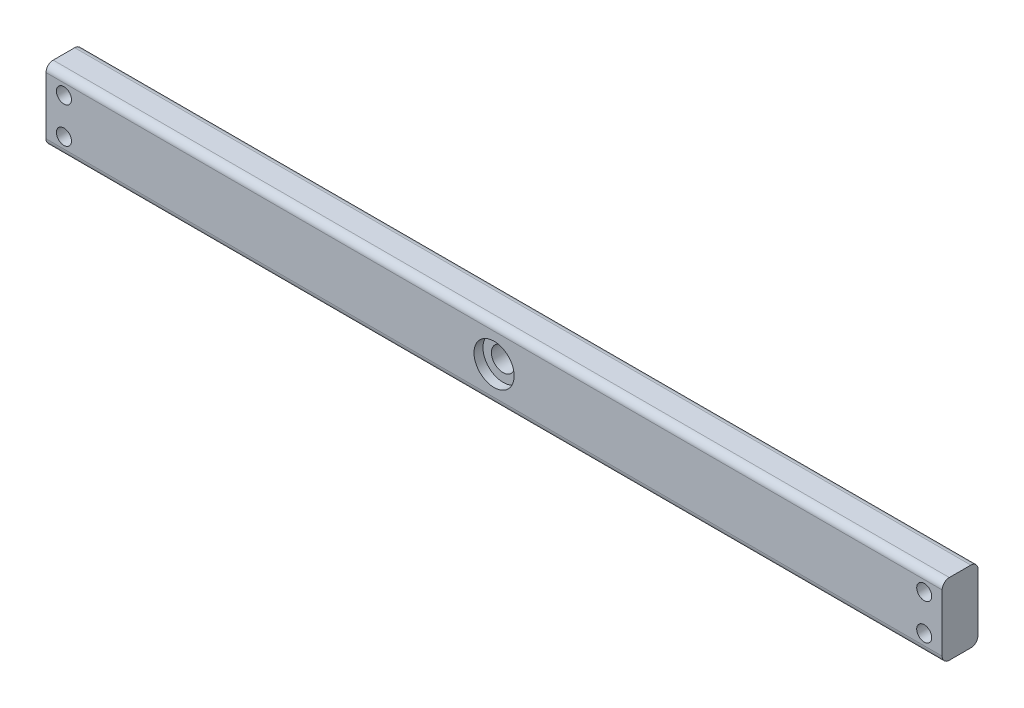
ISO-10303-21;
HEADER;
FILE_DESCRIPTION(('STEP AP214'),'2;1');
FILE_NAME('part.step','',(''),(''),'','','');
FILE_SCHEMA(('AUTOMOTIVE_DESIGN { 1 0 10303 214 1 1 1 1 }'));
ENDSEC;
DATA;
#1=APPLICATION_CONTEXT('core data for automotive mechanical design processes');
#2=APPLICATION_PROTOCOL_DEFINITION('international standard','automotive_design',2000,#1);
#3=PRODUCT_CONTEXT('',#1,'mechanical');
#4=PRODUCT('Part','Part','',(#3));
#5=PRODUCT_RELATED_PRODUCT_CATEGORY('part','',(#4));
#6=PRODUCT_DEFINITION_FORMATION('','',#4);
#7=PRODUCT_DEFINITION_CONTEXT('part definition',#1,'design');
#8=PRODUCT_DEFINITION('design','',#6,#7);
#9=PRODUCT_DEFINITION_SHAPE('','',#8);
#10=(LENGTH_UNIT() NAMED_UNIT(*) SI_UNIT(.MILLI.,.METRE.));
#11=(NAMED_UNIT(*) PLANE_ANGLE_UNIT() SI_UNIT($,.RADIAN.));
#12=(NAMED_UNIT(*) SI_UNIT($,.STERADIAN.) SOLID_ANGLE_UNIT());
#13=UNCERTAINTY_MEASURE_WITH_UNIT(LENGTH_MEASURE(1.E-05),#10,'distance_accuracy_value','');
#14=(GEOMETRIC_REPRESENTATION_CONTEXT(3) GLOBAL_UNCERTAINTY_ASSIGNED_CONTEXT((#13)) GLOBAL_UNIT_ASSIGNED_CONTEXT((#10,
#11,#12)) REPRESENTATION_CONTEXT('',''));
#15=CARTESIAN_POINT('',(0.,0.,0.));
#16=DIRECTION('',(0.,0.,1.));
#17=DIRECTION('',(1.,0.,0.));
#18=AXIS2_PLACEMENT_3D('',#15,#16,#17);
#19=CARTESIAN_POINT('',(0.,0.,5.));
#20=DIRECTION('',(0.,0.,-1.));
#21=DIRECTION('',(-1.,0.,0.));
#22=AXIS2_PLACEMENT_3D('',#19,#20,#21);
#23=CYLINDRICAL_SURFACE('',#22,3.25);
#24=CARTESIAN_POINT('',(0.,0.,-2.5));
#25=DIRECTION('',(0.,0.,-1.));
#26=DIRECTION('',(-1.,0.,0.));
#27=AXIS2_PLACEMENT_3D('',#24,#25,#26);
#28=CIRCLE('',#27,3.25);
#29=CARTESIAN_POINT('',(-3.25,0.,-2.5));
#30=VERTEX_POINT('',#29);
#31=EDGE_CURVE('E185',#30,#30,#28,.T.);
#32=ORIENTED_EDGE('',*,*,#31,.T.);
#33=EDGE_LOOP('',(#32));
#34=FACE_BOUND('',#33,.T.);
#35=CARTESIAN_POINT('',(0.,0.,2.5));
#36=DIRECTION('',(0.,0.,1.));
#37=DIRECTION('',(1.,0.,0.));
#38=AXIS2_PLACEMENT_3D('',#35,#36,#37);
#39=CIRCLE('',#38,3.25);
#40=CARTESIAN_POINT('',(3.25,0.,2.5));
#41=VERTEX_POINT('',#40);
#42=EDGE_CURVE('E142',#41,#41,#39,.T.);
#43=ORIENTED_EDGE('',*,*,#42,.T.);
#44=EDGE_LOOP('',(#43));
#45=FACE_BOUND('',#44,.T.);
#46=ADVANCED_FACE('F41',(#34,#45),#23,.F.);
#47=CARTESIAN_POINT('',(0.,0.,5.));
#48=DIRECTION('',(0.,0.,1.));
#49=DIRECTION('',(1.,0.,0.));
#50=AXIS2_PLACEMENT_3D('',#47,#48,#49);
#51=PLANE('',#50);
#52=CARTESIAN_POINT('',(120.,5.,5.));
#53=DIRECTION('',(0.,0.,1.));
#54=DIRECTION('',(-1.,0.,0.));
#55=AXIS2_PLACEMENT_3D('',#52,#53,#54);
#56=CIRCLE('',#55,2.1);
#57=CARTESIAN_POINT('',(117.9,5.,5.));
#58=VERTEX_POINT('',#57);
#59=EDGE_CURVE('E215',#58,#58,#56,.T.);
#60=ORIENTED_EDGE('',*,*,#59,.F.);
#61=EDGE_LOOP('',(#60));
#62=FACE_BOUND('',#61,.T.);
#63=CARTESIAN_POINT('',(120.,-5.,5.));
#64=DIRECTION('',(0.,0.,1.));
#65=DIRECTION('',(-1.,0.,0.));
#66=AXIS2_PLACEMENT_3D('',#63,#64,#65);
#67=CIRCLE('',#66,2.1);
#68=CARTESIAN_POINT('',(117.9,-5.,5.));
#69=VERTEX_POINT('',#68);
#70=EDGE_CURVE('E217',#69,#69,#67,.T.);
#71=ORIENTED_EDGE('',*,*,#70,.F.);
#72=EDGE_LOOP('',(#71));
#73=FACE_BOUND('',#72,.T.);
#74=CARTESIAN_POINT('',(-120.,-5.,5.));
#75=DIRECTION('',(0.,0.,1.));
#76=DIRECTION('',(1.,0.,0.));
#77=AXIS2_PLACEMENT_3D('',#74,#75,#76);
#78=CIRCLE('',#77,2.1);
#79=CARTESIAN_POINT('',(-117.9,-5.,5.));
#80=VERTEX_POINT('',#79);
#81=EDGE_CURVE('E206',#80,#80,#78,.T.);
#82=ORIENTED_EDGE('',*,*,#81,.F.);
#83=EDGE_LOOP('',(#82));
#84=FACE_BOUND('',#83,.T.);
#85=CARTESIAN_POINT('',(-120.,5.,5.));
#86=DIRECTION('',(0.,0.,1.));
#87=DIRECTION('',(1.,0.,0.));
#88=AXIS2_PLACEMENT_3D('',#85,#86,#87);
#89=CIRCLE('',#88,2.1);
#90=CARTESIAN_POINT('',(-117.9,5.,5.));
#91=VERTEX_POINT('',#90);
#92=EDGE_CURVE('E201',#91,#91,#89,.T.);
#93=ORIENTED_EDGE('',*,*,#92,.F.);
#94=EDGE_LOOP('',(#93));
#95=FACE_BOUND('',#94,.T.);
#96=CARTESIAN_POINT('',(0.,0.,5.));
#97=DIRECTION('',(0.,0.,1.));
#98=DIRECTION('',(1.,0.,0.));
#99=AXIS2_PLACEMENT_3D('',#96,#97,#98);
#100=CIRCLE('',#99,5.6);
#101=CARTESIAN_POINT('',(5.6,0.,5.));
#102=VERTEX_POINT('',#101);
#103=EDGE_CURVE('E198',#102,#102,#100,.T.);
#104=ORIENTED_EDGE('',*,*,#103,.F.);
#105=EDGE_LOOP('',(#104));
#106=FACE_BOUND('',#105,.T.);
#107=DIRECTION('',(0.,-1.,0.));
#108=VECTOR('',#107,1.);
#109=CARTESIAN_POINT('',(-125.,10.,5.));
#110=LINE('',#109,#108);
#111=CARTESIAN_POINT('',(-125.,8.,5.));
#112=VERTEX_POINT('',#111);
#113=CARTESIAN_POINT('',(-125.,-8.,5.));
#114=VERTEX_POINT('',#113);
#115=EDGE_CURVE('E129',#112,#114,#110,.T.);
#116=ORIENTED_EDGE('',*,*,#115,.T.);
#117=DIRECTION('',(1.,0.,0.));
#118=VECTOR('',#117,1.);
#119=CARTESIAN_POINT('',(125.,-8.,5.));
#120=LINE('',#119,#118);
#121=CARTESIAN_POINT('',(125.,-8.,5.));
#122=VERTEX_POINT('',#121);
#123=EDGE_CURVE('E159',#114,#122,#120,.T.);
#124=ORIENTED_EDGE('',*,*,#123,.T.);
#125=DIRECTION('',(0.,1.,0.));
#126=VECTOR('',#125,1.);
#127=CARTESIAN_POINT('',(125.,10.,5.));
#128=LINE('',#127,#126);
#129=CARTESIAN_POINT('',(125.,8.,5.));
#130=VERTEX_POINT('',#129);
#131=EDGE_CURVE('E115',#122,#130,#128,.T.);
#132=ORIENTED_EDGE('',*,*,#131,.T.);
#133=DIRECTION('',(-1.,0.,0.));
#134=VECTOR('',#133,1.);
#135=CARTESIAN_POINT('',(-125.,8.,5.));
#136=LINE('',#135,#134);
#137=EDGE_CURVE('E160',#130,#112,#136,.T.);
#138=ORIENTED_EDGE('',*,*,#137,.T.);
#139=EDGE_LOOP('',(#116,#124,#132,#138));
#140=FACE_BOUND('',#139,.T.);
#141=ADVANCED_FACE('F175',(#62,#73,#84,#95,#106,#140),#51,.T.);
#142=CARTESIAN_POINT('',(0.,0.,-5.));
#143=DIRECTION('',(0.,0.,1.));
#144=DIRECTION('',(1.,0.,0.));
#145=AXIS2_PLACEMENT_3D('',#142,#143,#144);
#146=PLANE('',#145);
#147=CARTESIAN_POINT('',(120.,5.,-5.));
#148=DIRECTION('',(0.,0.,1.));
#149=DIRECTION('',(-1.,0.,0.));
#150=AXIS2_PLACEMENT_3D('',#147,#148,#149);
#151=CIRCLE('',#150,2.1);
#152=CARTESIAN_POINT('',(117.9,5.,-5.));
#153=VERTEX_POINT('',#152);
#154=EDGE_CURVE('E207',#153,#153,#151,.T.);
#155=ORIENTED_EDGE('',*,*,#154,.T.);
#156=EDGE_LOOP('',(#155));
#157=FACE_BOUND('',#156,.T.);
#158=CARTESIAN_POINT('',(120.,-5.,-5.));
#159=DIRECTION('',(0.,0.,1.));
#160=DIRECTION('',(-1.,0.,0.));
#161=AXIS2_PLACEMENT_3D('',#158,#159,#160);
#162=CIRCLE('',#161,2.1);
#163=CARTESIAN_POINT('',(117.9,-5.,-5.));
#164=VERTEX_POINT('',#163);
#165=EDGE_CURVE('E214',#164,#164,#162,.T.);
#166=ORIENTED_EDGE('',*,*,#165,.T.);
#167=EDGE_LOOP('',(#166));
#168=FACE_BOUND('',#167,.T.);
#169=CARTESIAN_POINT('',(-120.,-5.,-5.));
#170=DIRECTION('',(0.,0.,1.));
#171=DIRECTION('',(1.,0.,0.));
#172=AXIS2_PLACEMENT_3D('',#169,#170,#171);
#173=CIRCLE('',#172,2.1);
#174=CARTESIAN_POINT('',(-117.9,-5.,-5.));
#175=VERTEX_POINT('',#174);
#176=EDGE_CURVE('E222',#175,#175,#173,.T.);
#177=ORIENTED_EDGE('',*,*,#176,.T.);
#178=EDGE_LOOP('',(#177));
#179=FACE_BOUND('',#178,.T.);
#180=CARTESIAN_POINT('',(-120.,5.,-5.));
#181=DIRECTION('',(0.,0.,1.));
#182=DIRECTION('',(1.,0.,0.));
#183=AXIS2_PLACEMENT_3D('',#180,#181,#182);
#184=CIRCLE('',#183,2.1);
#185=CARTESIAN_POINT('',(-117.9,5.,-5.));
#186=VERTEX_POINT('',#185);
#187=EDGE_CURVE('E199',#186,#186,#184,.T.);
#188=ORIENTED_EDGE('',*,*,#187,.T.);
#189=EDGE_LOOP('',(#188));
#190=FACE_BOUND('',#189,.T.);
#191=CARTESIAN_POINT('',(0.,0.,-5.));
#192=DIRECTION('',(0.,0.,-1.));
#193=DIRECTION('',(-1.,0.,0.));
#194=AXIS2_PLACEMENT_3D('',#191,#192,#193);
#195=CIRCLE('',#194,5.6);
#196=CARTESIAN_POINT('',(-5.6,0.,-5.));
#197=VERTEX_POINT('',#196);
#198=EDGE_CURVE('E186',#197,#197,#195,.T.);
#199=ORIENTED_EDGE('',*,*,#198,.F.);
#200=EDGE_LOOP('',(#199));
#201=FACE_BOUND('',#200,.T.);
#202=DIRECTION('',(0.,1.,0.));
#203=VECTOR('',#202,1.);
#204=CARTESIAN_POINT('',(125.,10.,-5.));
#205=LINE('',#204,#203);
#206=CARTESIAN_POINT('',(125.,-8.,-5.));
#207=VERTEX_POINT('',#206);
#208=CARTESIAN_POINT('',(125.,8.,-5.));
#209=VERTEX_POINT('',#208);
#210=EDGE_CURVE('E179',#207,#209,#205,.T.);
#211=ORIENTED_EDGE('',*,*,#210,.F.);
#212=DIRECTION('',(1.,0.,0.));
#213=VECTOR('',#212,1.);
#214=CARTESIAN_POINT('',(0.,-8.,-5.));
#215=LINE('',#214,#213);
#216=CARTESIAN_POINT('',(-125.,-8.,-5.));
#217=VERTEX_POINT('',#216);
#218=EDGE_CURVE('E147',#207,#217,#215,.F.);
#219=ORIENTED_EDGE('',*,*,#218,.T.);
#220=DIRECTION('',(0.,-1.,0.));
#221=VECTOR('',#220,1.);
#222=CARTESIAN_POINT('',(-125.,10.,-5.));
#223=LINE('',#222,#221);
#224=CARTESIAN_POINT('',(-125.,8.,-5.));
#225=VERTEX_POINT('',#224);
#226=EDGE_CURVE('E176',#225,#217,#223,.T.);
#227=ORIENTED_EDGE('',*,*,#226,.F.);
#228=DIRECTION('',(-1.,0.,0.));
#229=VECTOR('',#228,1.);
#230=CARTESIAN_POINT('',(0.,8.,-5.));
#231=LINE('',#230,#229);
#232=EDGE_CURVE('E146',#225,#209,#231,.F.);
#233=ORIENTED_EDGE('',*,*,#232,.T.);
#234=EDGE_LOOP('',(#211,#219,#227,#233));
#235=FACE_BOUND('',#234,.T.);
#236=ADVANCED_FACE('F231',(#157,#168,#179,#190,#201,#235),#146,.F.);
#237=CARTESIAN_POINT('',(125.,10.,5.));
#238=DIRECTION('',(-1.,0.,0.));
#239=DIRECTION('',(0.,0.,1.));
#240=AXIS2_PLACEMENT_3D('',#237,#238,#239);
#241=PLANE('',#240);
#242=DIRECTION('',(0.,0.,-1.));
#243=VECTOR('',#242,1.);
#244=CARTESIAN_POINT('',(125.,-10.,5.));
#245=LINE('',#244,#243);
#246=CARTESIAN_POINT('',(125.,-10.,3.));
#247=VERTEX_POINT('',#246);
#248=CARTESIAN_POINT('',(125.,-10.,-3.));
#249=VERTEX_POINT('',#248);
#250=EDGE_CURVE('E109',#247,#249,#245,.T.);
#251=ORIENTED_EDGE('',*,*,#250,.T.);
#252=CARTESIAN_POINT('',(125.,-8.,-3.));
#253=DIRECTION('',(-1.,0.,0.));
#254=DIRECTION('',(0.,0.,1.));
#255=AXIS2_PLACEMENT_3D('',#252,#253,#254);
#256=CIRCLE('',#255,2.);
#257=EDGE_CURVE('E120',#249,#207,#256,.F.);
#258=ORIENTED_EDGE('',*,*,#257,.T.);
#259=ORIENTED_EDGE('',*,*,#210,.T.);
#260=CARTESIAN_POINT('',(125.,8.,-3.));
#261=DIRECTION('',(-1.,0.,0.));
#262=DIRECTION('',(0.,0.,1.));
#263=AXIS2_PLACEMENT_3D('',#260,#261,#262);
#264=CIRCLE('',#263,2.);
#265=CARTESIAN_POINT('',(125.,10.,-3.));
#266=VERTEX_POINT('',#265);
#267=EDGE_CURVE('E118',#209,#266,#264,.F.);
#268=ORIENTED_EDGE('',*,*,#267,.T.);
#269=DIRECTION('',(0.,0.,-1.));
#270=VECTOR('',#269,1.);
#271=CARTESIAN_POINT('',(125.,10.,5.));
#272=LINE('',#271,#270);
#273=CARTESIAN_POINT('',(125.,10.,3.));
#274=VERTEX_POINT('',#273);
#275=EDGE_CURVE('E134',#274,#266,#272,.T.);
#276=ORIENTED_EDGE('',*,*,#275,.F.);
#277=CARTESIAN_POINT('',(125.,8.,3.));
#278=DIRECTION('',(-1.,0.,0.));
#279=DIRECTION('',(0.,0.,1.));
#280=AXIS2_PLACEMENT_3D('',#277,#278,#279);
#281=CIRCLE('',#280,2.);
#282=EDGE_CURVE('E136',#274,#130,#281,.F.);
#283=ORIENTED_EDGE('',*,*,#282,.T.);
#284=ORIENTED_EDGE('',*,*,#131,.F.);
#285=CARTESIAN_POINT('',(125.,-8.,3.));
#286=DIRECTION('',(-1.,0.,0.));
#287=DIRECTION('',(0.,0.,1.));
#288=AXIS2_PLACEMENT_3D('',#285,#286,#287);
#289=CIRCLE('',#288,2.);
#290=EDGE_CURVE('E110',#122,#247,#289,.F.);
#291=ORIENTED_EDGE('',*,*,#290,.T.);
#292=EDGE_LOOP('',(#251,#258,#259,#268,#276,#283,#284,#291));
#293=FACE_BOUND('',#292,.T.);
#294=ADVANCED_FACE('F108',(#293),#241,.F.);
#295=CARTESIAN_POINT('',(-125.,10.,5.));
#296=DIRECTION('',(0.,-1.,0.));
#297=DIRECTION('',(0.,0.,-1.));
#298=AXIS2_PLACEMENT_3D('',#295,#296,#297);
#299=PLANE('',#298);
#300=ORIENTED_EDGE('',*,*,#275,.T.);
#301=DIRECTION('',(-1.,0.,0.));
#302=VECTOR('',#301,1.);
#303=CARTESIAN_POINT('',(-125.,10.,-3.));
#304=LINE('',#303,#302);
#305=CARTESIAN_POINT('',(-125.,10.,-3.));
#306=VERTEX_POINT('',#305);
#307=EDGE_CURVE('E11',#266,#306,#304,.T.);
#308=ORIENTED_EDGE('',*,*,#307,.T.);
#309=DIRECTION('',(0.,0.,-1.));
#310=VECTOR('',#309,1.);
#311=CARTESIAN_POINT('',(-125.,10.,5.));
#312=LINE('',#311,#310);
#313=CARTESIAN_POINT('',(-125.,10.,3.));
#314=VERTEX_POINT('',#313);
#315=EDGE_CURVE('E138',#314,#306,#312,.T.);
#316=ORIENTED_EDGE('',*,*,#315,.F.);
#317=DIRECTION('',(-1.,0.,0.));
#318=VECTOR('',#317,1.);
#319=CARTESIAN_POINT('',(125.,10.,3.));
#320=LINE('',#319,#318);
#321=EDGE_CURVE('E47',#314,#274,#320,.F.);
#322=ORIENTED_EDGE('',*,*,#321,.T.);
#323=EDGE_LOOP('',(#300,#308,#316,#322));
#324=FACE_BOUND('',#323,.T.);
#325=ADVANCED_FACE('F163',(#324),#299,.F.);
#326=CARTESIAN_POINT('',(-125.,10.,5.));
#327=DIRECTION('',(1.,0.,0.));
#328=DIRECTION('',(0.,0.,-1.));
#329=AXIS2_PLACEMENT_3D('',#326,#327,#328);
#330=PLANE('',#329);
#331=ORIENTED_EDGE('',*,*,#226,.T.);
#332=CARTESIAN_POINT('',(-125.,-8.,-3.));
#333=DIRECTION('',(1.,0.,0.));
#334=DIRECTION('',(0.,0.,-1.));
#335=AXIS2_PLACEMENT_3D('',#332,#333,#334);
#336=CIRCLE('',#335,2.);
#337=CARTESIAN_POINT('',(-125.,-10.,-3.));
#338=VERTEX_POINT('',#337);
#339=EDGE_CURVE('E154',#217,#338,#336,.F.);
#340=ORIENTED_EDGE('',*,*,#339,.T.);
#341=DIRECTION('',(0.,0.,-1.));
#342=VECTOR('',#341,1.);
#343=CARTESIAN_POINT('',(-125.,-10.,5.));
#344=LINE('',#343,#342);
#345=CARTESIAN_POINT('',(-125.,-10.,3.));
#346=VERTEX_POINT('',#345);
#347=EDGE_CURVE('E126',#346,#338,#344,.T.);
#348=ORIENTED_EDGE('',*,*,#347,.F.);
#349=CARTESIAN_POINT('',(-125.,-8.,3.));
#350=DIRECTION('',(1.,0.,0.));
#351=DIRECTION('',(0.,0.,-1.));
#352=AXIS2_PLACEMENT_3D('',#349,#350,#351);
#353=CIRCLE('',#352,2.);
#354=EDGE_CURVE('E133',#346,#114,#353,.F.);
#355=ORIENTED_EDGE('',*,*,#354,.T.);
#356=ORIENTED_EDGE('',*,*,#115,.F.);
#357=CARTESIAN_POINT('',(-125.,8.,3.));
#358=DIRECTION('',(1.,0.,0.));
#359=DIRECTION('',(0.,0.,-1.));
#360=AXIS2_PLACEMENT_3D('',#357,#358,#359);
#361=CIRCLE('',#360,2.);
#362=EDGE_CURVE('E63',#112,#314,#361,.F.);
#363=ORIENTED_EDGE('',*,*,#362,.T.);
#364=ORIENTED_EDGE('',*,*,#315,.T.);
#365=CARTESIAN_POINT('',(-125.,8.,-3.));
#366=DIRECTION('',(1.,0.,0.));
#367=DIRECTION('',(0.,0.,-1.));
#368=AXIS2_PLACEMENT_3D('',#365,#366,#367);
#369=CIRCLE('',#368,2.);
#370=EDGE_CURVE('E57',#306,#225,#369,.F.);
#371=ORIENTED_EDGE('',*,*,#370,.T.);
#372=EDGE_LOOP('',(#331,#340,#348,#355,#356,#363,#364,#371));
#373=FACE_BOUND('',#372,.T.);
#374=ADVANCED_FACE('F174',(#373),#330,.F.);
#375=CARTESIAN_POINT('',(-125.,-10.,5.));
#376=DIRECTION('',(0.,1.,0.));
#377=DIRECTION('',(0.,0.,1.));
#378=AXIS2_PLACEMENT_3D('',#375,#376,#377);
#379=PLANE('',#378);
#380=ORIENTED_EDGE('',*,*,#347,.T.);
#381=DIRECTION('',(1.,0.,0.));
#382=VECTOR('',#381,1.);
#383=CARTESIAN_POINT('',(-125.,-10.,-3.));
#384=LINE('',#383,#382);
#385=EDGE_CURVE('E130',#338,#249,#384,.T.);
#386=ORIENTED_EDGE('',*,*,#385,.T.);
#387=ORIENTED_EDGE('',*,*,#250,.F.);
#388=DIRECTION('',(1.,0.,0.));
#389=VECTOR('',#388,1.);
#390=CARTESIAN_POINT('',(-125.,-10.,3.));
#391=LINE('',#390,#389);
#392=EDGE_CURVE('E123',#247,#346,#391,.F.);
#393=ORIENTED_EDGE('',*,*,#392,.T.);
#394=EDGE_LOOP('',(#380,#386,#387,#393));
#395=FACE_BOUND('',#394,.T.);
#396=ADVANCED_FACE('F122',(#395),#379,.F.);
#397=CARTESIAN_POINT('',(0.,0.,-2.5));
#398=DIRECTION('',(0.,0.,-1.));
#399=DIRECTION('',(-1.,0.,0.));
#400=AXIS2_PLACEMENT_3D('',#397,#398,#399);
#401=CYLINDRICAL_SURFACE('',#400,5.6);
#402=CARTESIAN_POINT('',(0.,0.,-2.5));
#403=DIRECTION('',(0.,0.,-1.));
#404=DIRECTION('',(-1.,0.,0.));
#405=AXIS2_PLACEMENT_3D('',#402,#403,#404);
#406=CIRCLE('',#405,5.6);
#407=CARTESIAN_POINT('',(-5.6,0.,-2.5));
#408=VERTEX_POINT('',#407);
#409=EDGE_CURVE('E187',#408,#408,#406,.T.);
#410=ORIENTED_EDGE('',*,*,#409,.F.);
#411=EDGE_LOOP('',(#410));
#412=FACE_BOUND('',#411,.T.);
#413=ORIENTED_EDGE('',*,*,#198,.T.);
#414=EDGE_LOOP('',(#413));
#415=FACE_BOUND('',#414,.T.);
#416=ADVANCED_FACE('F252',(#412,#415),#401,.F.);
#417=CARTESIAN_POINT('',(0.,0.,-2.5));
#418=DIRECTION('',(0.,0.,-1.));
#419=DIRECTION('',(-1.,0.,0.));
#420=AXIS2_PLACEMENT_3D('',#417,#418,#419);
#421=PLANE('',#420);
#422=ORIENTED_EDGE('',*,*,#31,.F.);
#423=EDGE_LOOP('',(#422));
#424=FACE_BOUND('',#423,.T.);
#425=ORIENTED_EDGE('',*,*,#409,.T.);
#426=EDGE_LOOP('',(#425));
#427=FACE_BOUND('',#426,.T.);
#428=ADVANCED_FACE('F242',(#424,#427),#421,.T.);
#429=CARTESIAN_POINT('',(0.,0.,2.5));
#430=DIRECTION('',(0.,0.,1.));
#431=DIRECTION('',(1.,0.,0.));
#432=AXIS2_PLACEMENT_3D('',#429,#430,#431);
#433=CYLINDRICAL_SURFACE('',#432,5.6);
#434=CARTESIAN_POINT('',(0.,0.,2.5));
#435=DIRECTION('',(0.,0.,1.));
#436=DIRECTION('',(1.,0.,0.));
#437=AXIS2_PLACEMENT_3D('',#434,#435,#436);
#438=CIRCLE('',#437,5.6);
#439=CARTESIAN_POINT('',(5.6,0.,2.5));
#440=VERTEX_POINT('',#439);
#441=EDGE_CURVE('E200',#440,#440,#438,.T.);
#442=ORIENTED_EDGE('',*,*,#441,.F.);
#443=EDGE_LOOP('',(#442));
#444=FACE_BOUND('',#443,.T.);
#445=ORIENTED_EDGE('',*,*,#103,.T.);
#446=EDGE_LOOP('',(#445));
#447=FACE_BOUND('',#446,.T.);
#448=ADVANCED_FACE('F236',(#444,#447),#433,.F.);
#449=CARTESIAN_POINT('',(0.,0.,2.5));
#450=DIRECTION('',(0.,0.,1.));
#451=DIRECTION('',(1.,0.,0.));
#452=AXIS2_PLACEMENT_3D('',#449,#450,#451);
#453=PLANE('',#452);
#454=ORIENTED_EDGE('',*,*,#42,.F.);
#455=EDGE_LOOP('',(#454));
#456=FACE_BOUND('',#455,.T.);
#457=ORIENTED_EDGE('',*,*,#441,.T.);
#458=EDGE_LOOP('',(#457));
#459=FACE_BOUND('',#458,.T.);
#460=ADVANCED_FACE('F238',(#456,#459),#453,.T.);
#461=CARTESIAN_POINT('',(-120.,5.,-5.));
#462=DIRECTION('',(0.,0.,1.));
#463=DIRECTION('',(1.,0.,0.));
#464=AXIS2_PLACEMENT_3D('',#461,#462,#463);
#465=CYLINDRICAL_SURFACE('',#464,2.1);
#466=ORIENTED_EDGE('',*,*,#187,.F.);
#467=EDGE_LOOP('',(#466));
#468=FACE_BOUND('',#467,.T.);
#469=ORIENTED_EDGE('',*,*,#92,.T.);
#470=EDGE_LOOP('',(#469));
#471=FACE_BOUND('',#470,.T.);
#472=ADVANCED_FACE('F247',(#468,#471),#465,.F.);
#473=CARTESIAN_POINT('',(-120.,-5.,-5.));
#474=DIRECTION('',(0.,0.,1.));
#475=DIRECTION('',(1.,0.,0.));
#476=AXIS2_PLACEMENT_3D('',#473,#474,#475);
#477=CYLINDRICAL_SURFACE('',#476,2.1);
#478=ORIENTED_EDGE('',*,*,#176,.F.);
#479=EDGE_LOOP('',(#478));
#480=FACE_BOUND('',#479,.T.);
#481=ORIENTED_EDGE('',*,*,#81,.T.);
#482=EDGE_LOOP('',(#481));
#483=FACE_BOUND('',#482,.T.);
#484=ADVANCED_FACE('F230',(#480,#483),#477,.F.);
#485=CARTESIAN_POINT('',(120.,-5.,-5.));
#486=DIRECTION('',(0.,0.,1.));
#487=DIRECTION('',(1.,0.,0.));
#488=AXIS2_PLACEMENT_3D('',#485,#486,#487);
#489=CYLINDRICAL_SURFACE('',#488,2.1);
#490=ORIENTED_EDGE('',*,*,#165,.F.);
#491=EDGE_LOOP('',(#490));
#492=FACE_BOUND('',#491,.T.);
#493=ORIENTED_EDGE('',*,*,#70,.T.);
#494=EDGE_LOOP('',(#493));
#495=FACE_BOUND('',#494,.T.);
#496=ADVANCED_FACE('F320',(#492,#495),#489,.F.);
#497=CARTESIAN_POINT('',(120.,5.,-5.));
#498=DIRECTION('',(0.,0.,1.));
#499=DIRECTION('',(1.,0.,0.));
#500=AXIS2_PLACEMENT_3D('',#497,#498,#499);
#501=CYLINDRICAL_SURFACE('',#500,2.1);
#502=ORIENTED_EDGE('',*,*,#154,.F.);
#503=EDGE_LOOP('',(#502));
#504=FACE_BOUND('',#503,.T.);
#505=ORIENTED_EDGE('',*,*,#59,.T.);
#506=EDGE_LOOP('',(#505));
#507=FACE_BOUND('',#506,.T.);
#508=ADVANCED_FACE('F277',(#504,#507),#501,.F.);
#509=CARTESIAN_POINT('',(-125.,-8.,-3.));
#510=DIRECTION('',(1.,0.,0.));
#511=DIRECTION('',(0.,0.,-1.));
#512=AXIS2_PLACEMENT_3D('',#509,#510,#511);
#513=CYLINDRICAL_SURFACE('',#512,2.);
#514=ORIENTED_EDGE('',*,*,#339,.F.);
#515=ORIENTED_EDGE('',*,*,#218,.F.);
#516=ORIENTED_EDGE('',*,*,#257,.F.);
#517=ORIENTED_EDGE('',*,*,#385,.F.);
#518=EDGE_LOOP('',(#514,#515,#516,#517));
#519=FACE_BOUND('',#518,.T.);
#520=ADVANCED_FACE('F272',(#519),#513,.T.);
#521=CARTESIAN_POINT('',(0.,-8.,3.));
#522=DIRECTION('',(-1.,0.,0.));
#523=DIRECTION('',(0.,0.,1.));
#524=AXIS2_PLACEMENT_3D('',#521,#522,#523);
#525=CYLINDRICAL_SURFACE('',#524,2.);
#526=ORIENTED_EDGE('',*,*,#354,.F.);
#527=ORIENTED_EDGE('',*,*,#392,.F.);
#528=ORIENTED_EDGE('',*,*,#290,.F.);
#529=ORIENTED_EDGE('',*,*,#123,.F.);
#530=EDGE_LOOP('',(#526,#527,#528,#529));
#531=FACE_BOUND('',#530,.T.);
#532=ADVANCED_FACE('F135',(#531),#525,.T.);
#533=CARTESIAN_POINT('',(-125.,8.,-3.));
#534=DIRECTION('',(-1.,0.,0.));
#535=DIRECTION('',(0.,0.,1.));
#536=AXIS2_PLACEMENT_3D('',#533,#534,#535);
#537=CYLINDRICAL_SURFACE('',#536,2.);
#538=ORIENTED_EDGE('',*,*,#267,.F.);
#539=ORIENTED_EDGE('',*,*,#232,.F.);
#540=ORIENTED_EDGE('',*,*,#370,.F.);
#541=ORIENTED_EDGE('',*,*,#307,.F.);
#542=EDGE_LOOP('',(#538,#539,#540,#541));
#543=FACE_BOUND('',#542,.T.);
#544=ADVANCED_FACE('F276',(#543),#537,.T.);
#545=CARTESIAN_POINT('',(0.,8.,3.));
#546=DIRECTION('',(1.,0.,0.));
#547=DIRECTION('',(0.,0.,-1.));
#548=AXIS2_PLACEMENT_3D('',#545,#546,#547);
#549=CYLINDRICAL_SURFACE('',#548,2.);
#550=ORIENTED_EDGE('',*,*,#282,.F.);
#551=ORIENTED_EDGE('',*,*,#321,.F.);
#552=ORIENTED_EDGE('',*,*,#362,.F.);
#553=ORIENTED_EDGE('',*,*,#137,.F.);
#554=EDGE_LOOP('',(#550,#551,#552,#553));
#555=FACE_BOUND('',#554,.T.);
#556=ADVANCED_FACE('F43',(#555),#549,.T.);
#557=CLOSED_SHELL('',(#46,#141,#236,#294,#325,#374,#396,#416,#428,#448,#460,#472,#484,#496,#508,
#520,#532,#544,#556));
#558=MANIFOLD_SOLID_BREP('B2',#557);
#559=ADVANCED_BREP_SHAPE_REPRESENTATION('',(#18,#558),#14);
#560=SHAPE_DEFINITION_REPRESENTATION(#9,#559);
ENDSEC;
END-ISO-10303-21;
